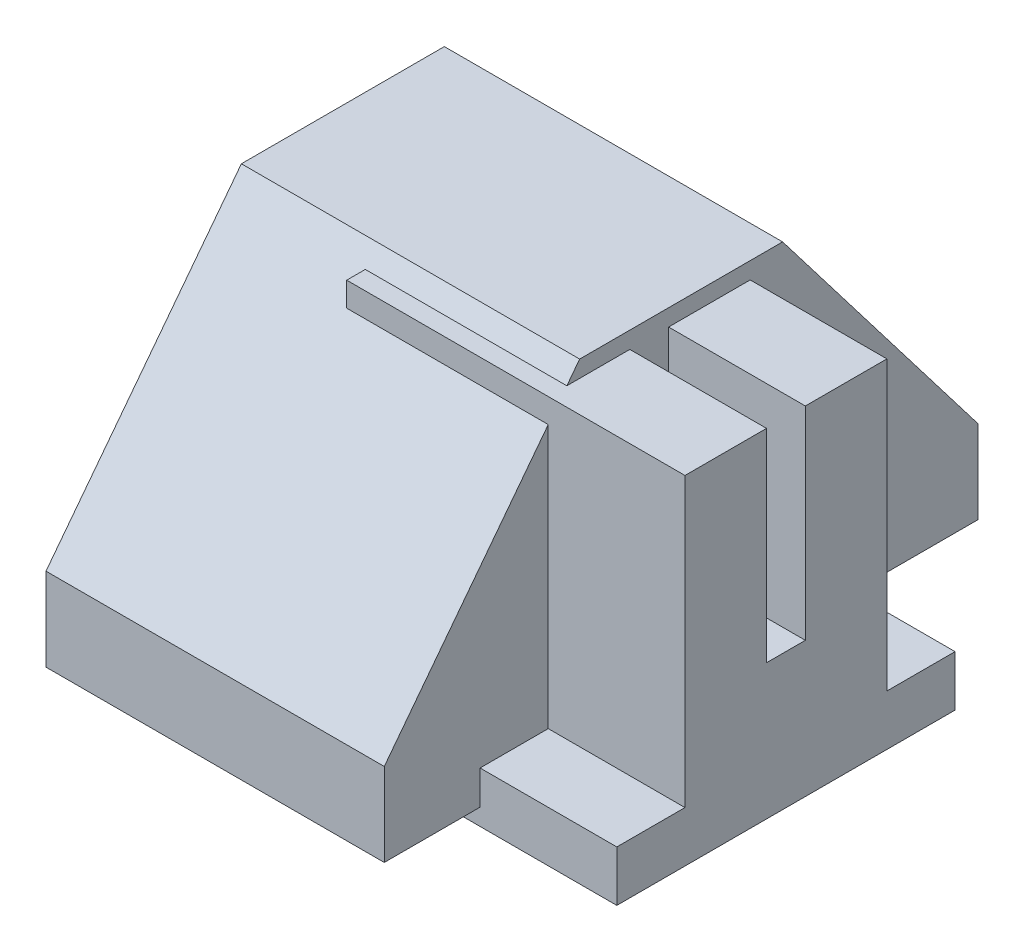
ISO-10303-21;
HEADER;
FILE_DESCRIPTION(('STEP AP214'),'2;1');
FILE_NAME('part.step','',(''),(''),'','','');
FILE_SCHEMA(('AUTOMOTIVE_DESIGN { 1 0 10303 214 1 1 1 1 }'));
ENDSEC;
DATA;
#1=APPLICATION_CONTEXT('core data for automotive mechanical design processes');
#2=APPLICATION_PROTOCOL_DEFINITION('international standard','automotive_design',2000,#1);
#3=PRODUCT_CONTEXT('',#1,'mechanical');
#4=PRODUCT('Part','Part','',(#3));
#5=PRODUCT_RELATED_PRODUCT_CATEGORY('part','',(#4));
#6=PRODUCT_DEFINITION_FORMATION('','',#4);
#7=PRODUCT_DEFINITION_CONTEXT('part definition',#1,'design');
#8=PRODUCT_DEFINITION('design','',#6,#7);
#9=PRODUCT_DEFINITION_SHAPE('','',#8);
#10=(LENGTH_UNIT() NAMED_UNIT(*) SI_UNIT(.MILLI.,.METRE.));
#11=(NAMED_UNIT(*) PLANE_ANGLE_UNIT() SI_UNIT($,.RADIAN.));
#12=(NAMED_UNIT(*) SI_UNIT($,.STERADIAN.) SOLID_ANGLE_UNIT());
#13=UNCERTAINTY_MEASURE_WITH_UNIT(LENGTH_MEASURE(1.E-05),#10,'distance_accuracy_value','');
#14=(GEOMETRIC_REPRESENTATION_CONTEXT(3) GLOBAL_UNCERTAINTY_ASSIGNED_CONTEXT((#13)) GLOBAL_UNIT_ASSIGNED_CONTEXT((#10,
#11,#12)) REPRESENTATION_CONTEXT('',''));
#15=CARTESIAN_POINT('',(0.,0.,0.));
#16=DIRECTION('',(0.,0.,1.));
#17=DIRECTION('',(1.,0.,0.));
#18=AXIS2_PLACEMENT_3D('',#15,#16,#17);
#19=CARTESIAN_POINT('',(-36.7744856282311,3.36962597201002,51.93957207844));
#20=DIRECTION('',(0.,0.,-1.));
#21=DIRECTION('',(-1.,0.,0.));
#22=AXIS2_PLACEMENT_3D('',#19,#20,#21);
#23=PLANE('',#22);
#24=DIRECTION('',(0.,-1.,0.));
#25=VECTOR('',#24,1.);
#26=CARTESIAN_POINT('',(-86.7744856282311,3.36962597201002,51.93957207844));
#27=LINE('',#26,#25);
#28=CARTESIAN_POINT('',(-86.7744856282311,3.36962597201002,51.93957207844));
#29=VERTEX_POINT('',#28);
#30=CARTESIAN_POINT('',(-86.7744856282311,-8.92020292663197,51.93957207844));
#31=VERTEX_POINT('',#30);
#32=EDGE_CURVE('E140',#29,#31,#27,.T.);
#33=ORIENTED_EDGE('',*,*,#32,.T.);
#34=DIRECTION('',(-1.,0.,0.));
#35=VECTOR('',#34,1.);
#36=CARTESIAN_POINT('',(-36.7744856282311,-8.92020292663197,51.93957207844));
#37=LINE('',#36,#35);
#38=CARTESIAN_POINT('',(-36.7744856282311,-8.92020292663197,51.93957207844));
#39=VERTEX_POINT('',#38);
#40=EDGE_CURVE('E12',#39,#31,#37,.T.);
#41=ORIENTED_EDGE('',*,*,#40,.F.);
#42=DIRECTION('',(0.,-1.,0.));
#43=VECTOR('',#42,1.);
#44=CARTESIAN_POINT('',(-36.7744856282311,3.36962597201002,51.93957207844));
#45=LINE('',#44,#43);
#46=CARTESIAN_POINT('',(-36.7744856282311,3.36962597201002,51.93957207844));
#47=VERTEX_POINT('',#46);
#48=EDGE_CURVE('E156',#47,#39,#45,.T.);
#49=ORIENTED_EDGE('',*,*,#48,.F.);
#50=DIRECTION('',(-1.,0.,0.));
#51=VECTOR('',#50,1.);
#52=CARTESIAN_POINT('',(-36.7744856282311,3.36962597201002,51.93957207844));
#53=LINE('',#52,#51);
#54=EDGE_CURVE('E136',#47,#29,#53,.T.);
#55=ORIENTED_EDGE('',*,*,#54,.T.);
#56=EDGE_LOOP('',(#33,#41,#49,#55));
#57=FACE_BOUND('',#56,.T.);
#58=ADVANCED_FACE('F51',(#57),#23,.F.);
#59=CARTESIAN_POINT('',(-36.7744856282311,-8.92020292663197,51.93957207844));
#60=DIRECTION('',(0.,1.,0.));
#61=DIRECTION('',(0.,0.,1.));
#62=AXIS2_PLACEMENT_3D('',#59,#60,#61);
#63=PLANE('',#62);
#64=DIRECTION('',(0.,0.,-1.));
#65=VECTOR('',#64,1.);
#66=CARTESIAN_POINT('',(-86.7744856282311,-8.92020292663197,51.93957207844));
#67=LINE('',#66,#65);
#68=CARTESIAN_POINT('',(-86.7744856282311,-8.92020292663197,-35.8190813322421));
#69=VERTEX_POINT('',#68);
#70=EDGE_CURVE('E144',#31,#69,#67,.T.);
#71=ORIENTED_EDGE('',*,*,#70,.T.);
#72=DIRECTION('',(-1.,0.,0.));
#73=VECTOR('',#72,1.);
#74=CARTESIAN_POINT('',(-36.7744856282311,-8.92020292663197,-35.8190813322421));
#75=LINE('',#74,#73);
#76=CARTESIAN_POINT('',(-36.7744856282311,-8.92020292663197,-35.8190813322421));
#77=VERTEX_POINT('',#76);
#78=EDGE_CURVE('E60',#77,#69,#75,.T.);
#79=ORIENTED_EDGE('',*,*,#78,.F.);
#80=DIRECTION('',(0.,0.,-1.));
#81=VECTOR('',#80,1.);
#82=CARTESIAN_POINT('',(-36.7744856282311,-8.92020292663197,51.93957207844));
#83=LINE('',#82,#81);
#84=EDGE_CURVE('E105',#39,#77,#83,.T.);
#85=ORIENTED_EDGE('',*,*,#84,.F.);
#86=ORIENTED_EDGE('',*,*,#40,.T.);
#87=EDGE_LOOP('',(#71,#79,#85,#86));
#88=FACE_BOUND('',#87,.T.);
#89=ADVANCED_FACE('F184',(#88),#63,.F.);
#90=CARTESIAN_POINT('',(-36.7744856282311,-8.92020292663197,-35.8190813322421));
#91=DIRECTION('',(0.,0.,1.));
#92=DIRECTION('',(1.,0.,0.));
#93=AXIS2_PLACEMENT_3D('',#90,#91,#92);
#94=PLANE('',#93);
#95=DIRECTION('',(0.,1.,0.));
#96=VECTOR('',#95,1.);
#97=CARTESIAN_POINT('',(-86.7744856282311,-8.92020292663197,-35.8190813322421));
#98=LINE('',#97,#96);
#99=CARTESIAN_POINT('',(-86.7744856282311,3.36962597201002,-35.8190813322421));
#100=VERTEX_POINT('',#99);
#101=EDGE_CURVE('E147',#69,#100,#98,.T.);
#102=ORIENTED_EDGE('',*,*,#101,.T.);
#103=DIRECTION('',(-1.,0.,0.));
#104=VECTOR('',#103,1.);
#105=CARTESIAN_POINT('',(-36.7744856282311,3.36962597201002,-35.8190813322421));
#106=LINE('',#105,#104);
#107=CARTESIAN_POINT('',(-36.7744856282311,3.36962597201002,-35.8190813322421));
#108=VERTEX_POINT('',#107);
#109=EDGE_CURVE('E129',#108,#100,#106,.T.);
#110=ORIENTED_EDGE('',*,*,#109,.F.);
#111=DIRECTION('',(0.,1.,0.));
#112=VECTOR('',#111,1.);
#113=CARTESIAN_POINT('',(-36.7744856282311,-8.92020292663197,-35.8190813322421));
#114=LINE('',#113,#112);
#115=EDGE_CURVE('E118',#77,#108,#114,.T.);
#116=ORIENTED_EDGE('',*,*,#115,.F.);
#117=ORIENTED_EDGE('',*,*,#78,.T.);
#118=EDGE_LOOP('',(#102,#110,#116,#117));
#119=FACE_BOUND('',#118,.T.);
#120=ADVANCED_FACE('F166',(#119),#94,.F.);
#121=CARTESIAN_POINT('',(-36.7744856282311,3.36962597201002,-35.8190813322421));
#122=DIRECTION('',(0.,-0.608009739937123,0.793929566234683));
#123=DIRECTION('',(0.,-0.793929566234683,-0.608009739937123));
#124=AXIS2_PLACEMENT_3D('',#121,#122,#123);
#125=PLANE('',#124);
#126=DIRECTION('',(0.,0.793929566234683,0.608009739937123));
#127=VECTOR('',#126,1.);
#128=CARTESIAN_POINT('',(-86.7744856282311,3.36962597201002,-35.8190813322421));
#129=LINE('',#128,#127);
#130=CARTESIAN_POINT('',(-86.7744856282311,41.079797073368,-6.93975462690105));
#131=VERTEX_POINT('',#130);
#132=EDGE_CURVE('E127',#100,#131,#129,.T.);
#133=ORIENTED_EDGE('',*,*,#132,.T.);
#134=DIRECTION('',(-1.,0.,0.));
#135=VECTOR('',#134,1.);
#136=CARTESIAN_POINT('',(-36.7744856282311,41.079797073368,-6.93975462690105));
#137=LINE('',#136,#135);
#138=CARTESIAN_POINT('',(-36.7744856282311,41.079797073368,-6.93975462690105));
#139=VERTEX_POINT('',#138);
#140=EDGE_CURVE('E124',#139,#131,#137,.T.);
#141=ORIENTED_EDGE('',*,*,#140,.F.);
#142=DIRECTION('',(0.,0.793929566234683,0.608009739937123));
#143=VECTOR('',#142,1.);
#144=CARTESIAN_POINT('',(-36.7744856282311,3.36962597201002,-35.8190813322421));
#145=LINE('',#144,#143);
#146=EDGE_CURVE('E112',#108,#139,#145,.T.);
#147=ORIENTED_EDGE('',*,*,#146,.F.);
#148=ORIENTED_EDGE('',*,*,#109,.T.);
#149=EDGE_LOOP('',(#133,#141,#147,#148));
#150=FACE_BOUND('',#149,.T.);
#151=ADVANCED_FACE('F125',(#150),#125,.F.);
#152=CARTESIAN_POINT('',(-36.7744856282311,41.079797073368,-6.93975462690105));
#153=DIRECTION('',(0.,-1.,0.));
#154=DIRECTION('',(0.,0.,-1.));
#155=AXIS2_PLACEMENT_3D('',#152,#153,#154);
#156=PLANE('',#155);
#157=DIRECTION('',(0.,0.,1.));
#158=VECTOR('',#157,1.);
#159=CARTESIAN_POINT('',(-86.7744856282311,41.079797073368,-6.93975462690105));
#160=LINE('',#159,#158);
#161=CARTESIAN_POINT('',(-86.7744856282311,41.079797073368,23.0602453730989));
#162=VERTEX_POINT('',#161);
#163=EDGE_CURVE('E91',#131,#162,#160,.T.);
#164=ORIENTED_EDGE('',*,*,#163,.T.);
#165=DIRECTION('',(-1.,0.,0.));
#166=VECTOR('',#165,1.);
#167=CARTESIAN_POINT('',(-36.7744856282311,41.079797073368,23.0602453730989));
#168=LINE('',#167,#166);
#169=CARTESIAN_POINT('',(-36.7744856282311,41.079797073368,23.0602453730989));
#170=VERTEX_POINT('',#169);
#171=EDGE_CURVE('E130',#170,#162,#168,.T.);
#172=ORIENTED_EDGE('',*,*,#171,.F.);
#173=DIRECTION('',(0.,0.,1.));
#174=VECTOR('',#173,1.);
#175=CARTESIAN_POINT('',(-36.7744856282311,41.079797073368,-6.93975462690105));
#176=LINE('',#175,#174);
#177=EDGE_CURVE('E116',#139,#170,#176,.T.);
#178=ORIENTED_EDGE('',*,*,#177,.F.);
#179=ORIENTED_EDGE('',*,*,#140,.T.);
#180=EDGE_LOOP('',(#164,#172,#178,#179));
#181=FACE_BOUND('',#180,.T.);
#182=ADVANCED_FACE('F132',(#181),#156,.F.);
#183=CARTESIAN_POINT('',(-36.7744856282311,41.079797073368,23.0602453730989));
#184=DIRECTION('',(0.,-0.608009739937124,-0.793929566234683));
#185=DIRECTION('',(0.,0.793929566234683,-0.608009739937124));
#186=AXIS2_PLACEMENT_3D('',#183,#184,#185);
#187=PLANE('',#186);
#188=DIRECTION('',(0.,-0.793929566234683,0.608009739937124));
#189=VECTOR('',#188,1.);
#190=CARTESIAN_POINT('',(-86.7744856282311,41.079797073368,23.0602453730989));
#191=LINE('',#190,#189);
#192=EDGE_CURVE('E97',#162,#29,#191,.T.);
#193=ORIENTED_EDGE('',*,*,#192,.T.);
#194=ORIENTED_EDGE('',*,*,#54,.F.);
#195=DIRECTION('',(0.,-0.793929566234683,0.608009739937124));
#196=VECTOR('',#195,1.);
#197=CARTESIAN_POINT('',(-36.7744856282311,41.079797073368,23.0602453730989));
#198=LINE('',#197,#196);
#199=EDGE_CURVE('E68',#170,#47,#198,.T.);
#200=ORIENTED_EDGE('',*,*,#199,.F.);
#201=ORIENTED_EDGE('',*,*,#171,.T.);
#202=EDGE_LOOP('',(#193,#194,#200,#201));
#203=FACE_BOUND('',#202,.T.);
#204=ADVANCED_FACE('F173',(#203),#187,.F.);
#205=CARTESIAN_POINT('',(-36.7744856282311,-8.92020292663197,51.93957207844));
#206=DIRECTION('',(1.,0.,0.));
#207=DIRECTION('',(0.,0.,-1.));
#208=AXIS2_PLACEMENT_3D('',#205,#206,#207);
#209=PLANE('',#208);
#210=ORIENTED_EDGE('',*,*,#48,.T.);
#211=ORIENTED_EDGE('',*,*,#84,.T.);
#212=ORIENTED_EDGE('',*,*,#115,.T.);
#213=ORIENTED_EDGE('',*,*,#146,.T.);
#214=ORIENTED_EDGE('',*,*,#177,.T.);
#215=ORIENTED_EDGE('',*,*,#199,.T.);
#216=EDGE_LOOP('',(#210,#211,#212,#213,#214,#215));
#217=FACE_BOUND('',#216,.T.);
#218=ADVANCED_FACE('F114',(#217),#209,.T.);
#219=CARTESIAN_POINT('',(-86.7744856282311,-8.92020292663197,51.93957207844));
#220=DIRECTION('',(1.,0.,0.));
#221=DIRECTION('',(0.,0.,-1.));
#222=AXIS2_PLACEMENT_3D('',#219,#220,#221);
#223=PLANE('',#222);
#224=ORIENTED_EDGE('',*,*,#32,.F.);
#225=ORIENTED_EDGE('',*,*,#192,.F.);
#226=ORIENTED_EDGE('',*,*,#163,.F.);
#227=ORIENTED_EDGE('',*,*,#132,.F.);
#228=ORIENTED_EDGE('',*,*,#101,.F.);
#229=ORIENTED_EDGE('',*,*,#70,.F.);
#230=EDGE_LOOP('',(#224,#225,#226,#227,#228,#229));
#231=FACE_BOUND('',#230,.T.);
#232=ADVANCED_FACE('F169',(#231),#223,.F.);
#233=CLOSED_SHELL('',(#58,#89,#120,#151,#182,#204,#218,#232));
#234=MANIFOLD_SOLID_BREP('B2',#233);
#235=CARTESIAN_POINT('',(-16.5649722388904,-3.905538089092,27.7024712103546));
#236=DIRECTION('',(0.,-1.,0.));
#237=DIRECTION('',(0.,0.,-1.));
#238=AXIS2_PLACEMENT_3D('',#235,#236,#237);
#239=PLANE('',#238);
#240=DIRECTION('',(0.,0.,1.));
#241=VECTOR('',#240,1.);
#242=CARTESIAN_POINT('',(-66.5649722388904,-3.905538089092,27.7024712103546));
#243=LINE('',#242,#241);
#244=CARTESIAN_POINT('',(-66.5649722388904,-3.905538089092,27.7024712103546));
#245=VERTEX_POINT('',#244);
#246=CARTESIAN_POINT('',(-66.5649722388904,-3.905538089092,37.7787935627372));
#247=VERTEX_POINT('',#246);
#248=EDGE_CURVE('E365',#245,#247,#243,.T.);
#249=ORIENTED_EDGE('',*,*,#248,.T.);
#250=DIRECTION('',(-1.,0.,0.));
#251=VECTOR('',#250,1.);
#252=CARTESIAN_POINT('',(-16.5649722388904,-3.905538089092,37.7787935627372));
#253=LINE('',#252,#251);
#254=CARTESIAN_POINT('',(-16.5649722388904,-3.905538089092,37.7787935627372));
#255=VERTEX_POINT('',#254);
#256=EDGE_CURVE('E49',#255,#247,#253,.T.);
#257=ORIENTED_EDGE('',*,*,#256,.F.);
#258=DIRECTION('',(0.,0.,1.));
#259=VECTOR('',#258,1.);
#260=CARTESIAN_POINT('',(-16.5649722388904,-3.905538089092,27.7024712103546));
#261=LINE('',#260,#259);
#262=CARTESIAN_POINT('',(-16.5649722388904,-3.905538089092,27.7024712103546));
#263=VERTEX_POINT('',#262);
#264=EDGE_CURVE('E387',#263,#255,#261,.T.);
#265=ORIENTED_EDGE('',*,*,#264,.F.);
#266=DIRECTION('',(-1.,0.,0.));
#267=VECTOR('',#266,1.);
#268=CARTESIAN_POINT('',(-16.5649722388904,-3.905538089092,27.7024712103546));
#269=LINE('',#268,#267);
#270=EDGE_CURVE('E361',#263,#245,#269,.T.);
#271=ORIENTED_EDGE('',*,*,#270,.T.);
#272=EDGE_LOOP('',(#249,#257,#265,#271));
#273=FACE_BOUND('',#272,.T.);
#274=ADVANCED_FACE('F245',(#273),#239,.F.);
#275=CARTESIAN_POINT('',(-16.5649722388904,-3.905538089092,37.7787935627372));
#276=DIRECTION('',(0.,0.,-1.));
#277=DIRECTION('',(-1.,0.,0.));
#278=AXIS2_PLACEMENT_3D('',#275,#276,#277);
#279=PLANE('',#278);
#280=DIRECTION('',(0.,-1.,0.));
#281=VECTOR('',#280,1.);
#282=CARTESIAN_POINT('',(-66.5649722388904,-3.905538089092,37.7787935627372));
#283=LINE('',#282,#281);
#284=CARTESIAN_POINT('',(-66.5649722388904,-11.3934632551037,37.7787935627372));
#285=VERTEX_POINT('',#284);
#286=EDGE_CURVE('E368',#247,#285,#283,.T.);
#287=ORIENTED_EDGE('',*,*,#286,.T.);
#288=DIRECTION('',(-1.,0.,0.));
#289=VECTOR('',#288,1.);
#290=CARTESIAN_POINT('',(-16.5649722388904,-11.3934632551037,37.7787935627372));
#291=LINE('',#290,#289);
#292=CARTESIAN_POINT('',(-16.5649722388904,-11.3934632551037,37.7787935627372));
#293=VERTEX_POINT('',#292);
#294=EDGE_CURVE('E253',#293,#285,#291,.T.);
#295=ORIENTED_EDGE('',*,*,#294,.F.);
#296=DIRECTION('',(0.,-1.,0.));
#297=VECTOR('',#296,1.);
#298=CARTESIAN_POINT('',(-16.5649722388904,-3.905538089092,37.7787935627372));
#299=LINE('',#298,#297);
#300=EDGE_CURVE('E316',#255,#293,#299,.T.);
#301=ORIENTED_EDGE('',*,*,#300,.F.);
#302=ORIENTED_EDGE('',*,*,#256,.T.);
#303=EDGE_LOOP('',(#287,#295,#301,#302));
#304=FACE_BOUND('',#303,.T.);
#305=ADVANCED_FACE('F465',(#304),#279,.F.);
#306=CARTESIAN_POINT('',(-16.5649722388904,-11.3934632551037,37.7787935627372));
#307=DIRECTION('',(0.,1.,0.));
#308=DIRECTION('',(0.,0.,1.));
#309=AXIS2_PLACEMENT_3D('',#306,#307,#308);
#310=PLANE('',#309);
#311=DIRECTION('',(0.,0.,-1.));
#312=VECTOR('',#311,1.);
#313=CARTESIAN_POINT('',(-66.5649722388904,-11.3934632551037,37.7787935627372));
#314=LINE('',#313,#312);
#315=CARTESIAN_POINT('',(-66.5649722388904,-11.3934632551037,-12.2212064372628));
#316=VERTEX_POINT('',#315);
#317=EDGE_CURVE('E370',#285,#316,#314,.T.);
#318=ORIENTED_EDGE('',*,*,#317,.T.);
#319=DIRECTION('',(-1.,0.,0.));
#320=VECTOR('',#319,1.);
#321=CARTESIAN_POINT('',(-16.5649722388904,-11.3934632551037,-12.2212064372628));
#322=LINE('',#321,#320);
#323=CARTESIAN_POINT('',(-16.5649722388904,-11.3934632551037,-12.2212064372628));
#324=VERTEX_POINT('',#323);
#325=EDGE_CURVE('E406',#324,#316,#322,.T.);
#326=ORIENTED_EDGE('',*,*,#325,.F.);
#327=DIRECTION('',(0.,0.,-1.));
#328=VECTOR('',#327,1.);
#329=CARTESIAN_POINT('',(-16.5649722388904,-11.3934632551037,37.7787935627372));
#330=LINE('',#329,#328);
#331=EDGE_CURVE('E414',#293,#324,#330,.T.);
#332=ORIENTED_EDGE('',*,*,#331,.F.);
#333=ORIENTED_EDGE('',*,*,#294,.T.);
#334=EDGE_LOOP('',(#318,#326,#332,#333));
#335=FACE_BOUND('',#334,.T.);
#336=ADVANCED_FACE('F412',(#335),#310,.F.);
#337=CARTESIAN_POINT('',(-16.5649722388904,-11.3934632551037,-12.2212064372628));
#338=DIRECTION('',(0.,0.,1.));
#339=DIRECTION('',(1.,0.,0.));
#340=AXIS2_PLACEMENT_3D('',#337,#338,#339);
#341=PLANE('',#340);
#342=DIRECTION('',(0.,1.,0.));
#343=VECTOR('',#342,1.);
#344=CARTESIAN_POINT('',(-66.5649722388904,-11.3934632551037,-12.2212064372628));
#345=LINE('',#344,#343);
#346=CARTESIAN_POINT('',(-66.5649722388904,-3.905538089092,-12.2212064372628));
#347=VERTEX_POINT('',#346);
#348=EDGE_CURVE('E372',#316,#347,#345,.T.);
#349=ORIENTED_EDGE('',*,*,#348,.T.);
#350=DIRECTION('',(-1.,0.,0.));
#351=VECTOR('',#350,1.);
#352=CARTESIAN_POINT('',(-16.5649722388904,-3.905538089092,-12.2212064372628));
#353=LINE('',#352,#351);
#354=CARTESIAN_POINT('',(-16.5649722388904,-3.905538089092,-12.2212064372628));
#355=VERTEX_POINT('',#354);
#356=EDGE_CURVE('E403',#355,#347,#353,.T.);
#357=ORIENTED_EDGE('',*,*,#356,.F.);
#358=DIRECTION('',(0.,1.,0.));
#359=VECTOR('',#358,1.);
#360=CARTESIAN_POINT('',(-16.5649722388904,-11.3934632551037,-12.2212064372628));
#361=LINE('',#360,#359);
#362=EDGE_CURVE('E432',#324,#355,#361,.T.);
#363=ORIENTED_EDGE('',*,*,#362,.F.);
#364=ORIENTED_EDGE('',*,*,#325,.T.);
#365=EDGE_LOOP('',(#349,#357,#363,#364));
#366=FACE_BOUND('',#365,.T.);
#367=ADVANCED_FACE('F423',(#366),#341,.F.);
#368=CARTESIAN_POINT('',(-16.5649722388904,-3.905538089092,-12.2212064372628));
#369=DIRECTION('',(0.,-1.,0.));
#370=DIRECTION('',(0.,0.,-1.));
#371=AXIS2_PLACEMENT_3D('',#368,#369,#370);
#372=PLANE('',#371);
#373=DIRECTION('',(0.,0.,1.));
#374=VECTOR('',#373,1.);
#375=CARTESIAN_POINT('',(-66.5649722388904,-3.905538089092,-12.2212064372628));
#376=LINE('',#375,#374);
#377=CARTESIAN_POINT('',(-66.5649722388904,-3.905538089092,-2.14488408488021));
#378=VERTEX_POINT('',#377);
#379=EDGE_CURVE('E374',#347,#378,#376,.T.);
#380=ORIENTED_EDGE('',*,*,#379,.T.);
#381=DIRECTION('',(-1.,0.,0.));
#382=VECTOR('',#381,1.);
#383=CARTESIAN_POINT('',(-16.5649722388904,-3.905538089092,-2.14488408488021));
#384=LINE('',#383,#382);
#385=CARTESIAN_POINT('',(-16.5649722388904,-3.905538089092,-2.14488408488021));
#386=VERTEX_POINT('',#385);
#387=EDGE_CURVE('E400',#386,#378,#384,.T.);
#388=ORIENTED_EDGE('',*,*,#387,.F.);
#389=DIRECTION('',(0.,0.,1.));
#390=VECTOR('',#389,1.);
#391=CARTESIAN_POINT('',(-16.5649722388904,-3.905538089092,-12.2212064372628));
#392=LINE('',#391,#390);
#393=EDGE_CURVE('E429',#355,#386,#392,.T.);
#394=ORIENTED_EDGE('',*,*,#393,.F.);
#395=ORIENTED_EDGE('',*,*,#356,.T.);
#396=EDGE_LOOP('',(#380,#388,#394,#395));
#397=FACE_BOUND('',#396,.T.);
#398=ADVANCED_FACE('F427',(#397),#372,.F.);
#399=CARTESIAN_POINT('',(-16.5649722388904,-3.905538089092,-2.14488408488021));
#400=DIRECTION('',(0.,0.,1.));
#401=DIRECTION('',(1.,0.,0.));
#402=AXIS2_PLACEMENT_3D('',#399,#400,#401);
#403=PLANE('',#402);
#404=DIRECTION('',(0.,1.,0.));
#405=VECTOR('',#404,1.);
#406=CARTESIAN_POINT('',(-66.5649722388904,-3.905538089092,-2.14488408488021));
#407=LINE('',#406,#405);
#408=CARTESIAN_POINT('',(-66.5649722388904,38.6065367448964,-2.14488408488021));
#409=VERTEX_POINT('',#408);
#410=EDGE_CURVE('E376',#378,#409,#407,.T.);
#411=ORIENTED_EDGE('',*,*,#410,.T.);
#412=DIRECTION('',(-1.,0.,0.));
#413=VECTOR('',#412,1.);
#414=CARTESIAN_POINT('',(-16.5649722388904,38.6065367448964,-2.14488408488021));
#415=LINE('',#414,#413);
#416=CARTESIAN_POINT('',(-16.5649722388904,38.6065367448964,-2.14488408488021));
#417=VERTEX_POINT('',#416);
#418=EDGE_CURVE('E397',#417,#409,#415,.T.);
#419=ORIENTED_EDGE('',*,*,#418,.F.);
#420=DIRECTION('',(0.,1.,0.));
#421=VECTOR('',#420,1.);
#422=CARTESIAN_POINT('',(-16.5649722388904,-3.905538089092,-2.14488408488021));
#423=LINE('',#422,#421);
#424=EDGE_CURVE('E431',#386,#417,#423,.T.);
#425=ORIENTED_EDGE('',*,*,#424,.F.);
#426=ORIENTED_EDGE('',*,*,#387,.T.);
#427=EDGE_LOOP('',(#411,#419,#425,#426));
#428=FACE_BOUND('',#427,.T.);
#429=ADVANCED_FACE('F478',(#428),#403,.F.);
#430=CARTESIAN_POINT('',(-16.5649722388904,38.6065367448964,-2.14488408488021));
#431=DIRECTION('',(0.,-1.,0.));
#432=DIRECTION('',(0.,0.,-1.));
#433=AXIS2_PLACEMENT_3D('',#430,#431,#432);
#434=PLANE('',#433);
#435=DIRECTION('',(0.,0.,1.));
#436=VECTOR('',#435,1.);
#437=CARTESIAN_POINT('',(-66.5649722388904,38.6065367448964,-2.14488408488021));
#438=LINE('',#437,#436);
#439=CARTESIAN_POINT('',(-66.5649722388904,38.6065367448964,9.91044619744044));
#440=VERTEX_POINT('',#439);
#441=EDGE_CURVE('E378',#409,#440,#438,.T.);
#442=ORIENTED_EDGE('',*,*,#441,.T.);
#443=DIRECTION('',(-1.,0.,0.));
#444=VECTOR('',#443,1.);
#445=CARTESIAN_POINT('',(-16.5649722388904,38.6065367448964,9.91044619744044));
#446=LINE('',#445,#444);
#447=CARTESIAN_POINT('',(-16.5649722388904,38.6065367448964,9.91044619744044));
#448=VERTEX_POINT('',#447);
#449=EDGE_CURVE('E394',#448,#440,#446,.T.);
#450=ORIENTED_EDGE('',*,*,#449,.F.);
#451=DIRECTION('',(0.,0.,1.));
#452=VECTOR('',#451,1.);
#453=CARTESIAN_POINT('',(-16.5649722388904,38.6065367448964,-2.14488408488021));
#454=LINE('',#453,#452);
#455=EDGE_CURVE('E434',#417,#448,#454,.T.);
#456=ORIENTED_EDGE('',*,*,#455,.F.);
#457=ORIENTED_EDGE('',*,*,#418,.T.);
#458=EDGE_LOOP('',(#442,#450,#456,#457));
#459=FACE_BOUND('',#458,.T.);
#460=ADVANCED_FACE('F481',(#459),#434,.F.);
#461=CARTESIAN_POINT('',(-16.5649722388904,38.6065367448964,9.91044619744044));
#462=DIRECTION('',(0.,0.,-1.));
#463=DIRECTION('',(-1.,0.,0.));
#464=AXIS2_PLACEMENT_3D('',#461,#462,#463);
#465=PLANE('',#464);
#466=DIRECTION('',(0.,-1.,0.));
#467=VECTOR('',#466,1.);
#468=CARTESIAN_POINT('',(-66.5649722388904,38.6065367448964,9.91044619744044));
#469=LINE('',#468,#467);
#470=CARTESIAN_POINT('',(-66.5649722388904,8.60653674489634,9.91044619744044));
#471=VERTEX_POINT('',#470);
#472=EDGE_CURVE('E380',#440,#471,#469,.T.);
#473=ORIENTED_EDGE('',*,*,#472,.T.);
#474=DIRECTION('',(-1.,0.,0.));
#475=VECTOR('',#474,1.);
#476=CARTESIAN_POINT('',(-16.5649722388904,8.60653674489634,9.91044619744044));
#477=LINE('',#476,#475);
#478=CARTESIAN_POINT('',(-16.5649722388904,8.60653674489634,9.91044619744044));
#479=VERTEX_POINT('',#478);
#480=EDGE_CURVE('E391',#479,#471,#477,.T.);
#481=ORIENTED_EDGE('',*,*,#480,.F.);
#482=DIRECTION('',(0.,-1.,0.));
#483=VECTOR('',#482,1.);
#484=CARTESIAN_POINT('',(-16.5649722388904,38.6065367448964,9.91044619744044));
#485=LINE('',#484,#483);
#486=EDGE_CURVE('E440',#448,#479,#485,.T.);
#487=ORIENTED_EDGE('',*,*,#486,.F.);
#488=ORIENTED_EDGE('',*,*,#449,.T.);
#489=EDGE_LOOP('',(#473,#481,#487,#488));
#490=FACE_BOUND('',#489,.T.);
#491=ADVANCED_FACE('F446',(#490),#465,.F.);
#492=CARTESIAN_POINT('',(-16.5649722388904,8.60653674489634,9.91044619744044));
#493=DIRECTION('',(0.,-1.,0.));
#494=DIRECTION('',(0.,0.,-1.));
#495=AXIS2_PLACEMENT_3D('',#492,#493,#494);
#496=PLANE('',#495);
#497=DIRECTION('',(0.,0.,1.));
#498=VECTOR('',#497,1.);
#499=CARTESIAN_POINT('',(-66.5649722388904,8.60653674489634,9.91044619744044));
#500=LINE('',#499,#498);
#501=CARTESIAN_POINT('',(-66.5649722388904,8.60653674489634,15.647140928034));
#502=VERTEX_POINT('',#501);
#503=EDGE_CURVE('E382',#471,#502,#500,.T.);
#504=ORIENTED_EDGE('',*,*,#503,.T.);
#505=DIRECTION('',(-1.,0.,0.));
#506=VECTOR('',#505,1.);
#507=CARTESIAN_POINT('',(-16.5649722388904,8.60653674489634,15.647140928034));
#508=LINE('',#507,#506);
#509=CARTESIAN_POINT('',(-16.5649722388904,8.60653674489634,15.647140928034));
#510=VERTEX_POINT('',#509);
#511=EDGE_CURVE('E356',#510,#502,#508,.T.);
#512=ORIENTED_EDGE('',*,*,#511,.F.);
#513=DIRECTION('',(0.,0.,1.));
#514=VECTOR('',#513,1.);
#515=CARTESIAN_POINT('',(-16.5649722388904,8.60653674489634,9.91044619744044));
#516=LINE('',#515,#514);
#517=EDGE_CURVE('E347',#479,#510,#516,.T.);
#518=ORIENTED_EDGE('',*,*,#517,.F.);
#519=ORIENTED_EDGE('',*,*,#480,.T.);
#520=EDGE_LOOP('',(#504,#512,#518,#519));
#521=FACE_BOUND('',#520,.T.);
#522=ADVANCED_FACE('F450',(#521),#496,.F.);
#523=CARTESIAN_POINT('',(-16.5649722388904,8.60653674489634,15.647140928034));
#524=DIRECTION('',(0.,0.,1.));
#525=DIRECTION('',(1.,0.,0.));
#526=AXIS2_PLACEMENT_3D('',#523,#524,#525);
#527=PLANE('',#526);
#528=DIRECTION('',(0.,1.,0.));
#529=VECTOR('',#528,1.);
#530=CARTESIAN_POINT('',(-66.5649722388904,8.60653674489634,15.647140928034));
#531=LINE('',#530,#529);
#532=CARTESIAN_POINT('',(-66.5649722388904,38.6065367448963,15.647140928034));
#533=VERTEX_POINT('',#532);
#534=EDGE_CURVE('E355',#502,#533,#531,.T.);
#535=ORIENTED_EDGE('',*,*,#534,.T.);
#536=DIRECTION('',(-1.,0.,0.));
#537=VECTOR('',#536,1.);
#538=CARTESIAN_POINT('',(-16.5649722388904,38.6065367448963,15.647140928034));
#539=LINE('',#538,#537);
#540=CARTESIAN_POINT('',(-16.5649722388904,38.6065367448963,15.647140928034));
#541=VERTEX_POINT('',#540);
#542=EDGE_CURVE('E352',#541,#533,#539,.T.);
#543=ORIENTED_EDGE('',*,*,#542,.F.);
#544=DIRECTION('',(0.,1.,0.));
#545=VECTOR('',#544,1.);
#546=CARTESIAN_POINT('',(-16.5649722388904,8.60653674489634,15.647140928034));
#547=LINE('',#546,#545);
#548=EDGE_CURVE('E341',#510,#541,#547,.T.);
#549=ORIENTED_EDGE('',*,*,#548,.F.);
#550=ORIENTED_EDGE('',*,*,#511,.T.);
#551=EDGE_LOOP('',(#535,#543,#549,#550));
#552=FACE_BOUND('',#551,.T.);
#553=ADVANCED_FACE('F353',(#552),#527,.F.);
#554=CARTESIAN_POINT('',(-16.5649722388904,38.6065367448963,15.647140928034));
#555=DIRECTION('',(0.,-1.,0.));
#556=DIRECTION('',(0.,0.,-1.));
#557=AXIS2_PLACEMENT_3D('',#554,#555,#556);
#558=PLANE('',#557);
#559=DIRECTION('',(0.,0.,1.));
#560=VECTOR('',#559,1.);
#561=CARTESIAN_POINT('',(-66.5649722388904,38.6065367448963,15.647140928034));
#562=LINE('',#561,#560);
#563=CARTESIAN_POINT('',(-66.5649722388904,38.6065367448963,27.7024712103547));
#564=VERTEX_POINT('',#563);
#565=EDGE_CURVE('E302',#533,#564,#562,.T.);
#566=ORIENTED_EDGE('',*,*,#565,.T.);
#567=DIRECTION('',(-1.,0.,0.));
#568=VECTOR('',#567,1.);
#569=CARTESIAN_POINT('',(-16.5649722388904,38.6065367448963,27.7024712103547));
#570=LINE('',#569,#568);
#571=CARTESIAN_POINT('',(-16.5649722388904,38.6065367448963,27.7024712103547));
#572=VERTEX_POINT('',#571);
#573=EDGE_CURVE('E357',#572,#564,#570,.T.);
#574=ORIENTED_EDGE('',*,*,#573,.F.);
#575=DIRECTION('',(0.,0.,1.));
#576=VECTOR('',#575,1.);
#577=CARTESIAN_POINT('',(-16.5649722388904,38.6065367448963,15.647140928034));
#578=LINE('',#577,#576);
#579=EDGE_CURVE('E345',#541,#572,#578,.T.);
#580=ORIENTED_EDGE('',*,*,#579,.F.);
#581=ORIENTED_EDGE('',*,*,#542,.T.);
#582=EDGE_LOOP('',(#566,#574,#580,#581));
#583=FACE_BOUND('',#582,.T.);
#584=ADVANCED_FACE('F359',(#583),#558,.F.);
#585=CARTESIAN_POINT('',(-16.5649722388904,38.6065367448963,27.7024712103547));
#586=DIRECTION('',(0.,0.,-1.));
#587=DIRECTION('',(0.,1.,0.));
#588=AXIS2_PLACEMENT_3D('',#585,#586,#587);
#589=PLANE('',#588);
#590=DIRECTION('',(0.,-1.,0.));
#591=VECTOR('',#590,1.);
#592=CARTESIAN_POINT('',(-66.5649722388904,38.6065367448963,27.7024712103547));
#593=LINE('',#592,#591);
#594=EDGE_CURVE('E308',#564,#245,#593,.T.);
#595=ORIENTED_EDGE('',*,*,#594,.T.);
#596=ORIENTED_EDGE('',*,*,#270,.F.);
#597=DIRECTION('',(0.,-1.,0.));
#598=VECTOR('',#597,1.);
#599=CARTESIAN_POINT('',(-16.5649722388904,38.6065367448963,27.7024712103547));
#600=LINE('',#599,#598);
#601=EDGE_CURVE('E261',#572,#263,#600,.T.);
#602=ORIENTED_EDGE('',*,*,#601,.F.);
#603=ORIENTED_EDGE('',*,*,#573,.T.);
#604=EDGE_LOOP('',(#595,#596,#602,#603));
#605=FACE_BOUND('',#604,.T.);
#606=ADVANCED_FACE('F454',(#605),#589,.F.);
#607=CARTESIAN_POINT('',(-16.5649722388904,-3.905538089092,37.7787935627372));
#608=DIRECTION('',(1.,0.,0.));
#609=DIRECTION('',(0.,0.,-1.));
#610=AXIS2_PLACEMENT_3D('',#607,#608,#609);
#611=PLANE('',#610);
#612=ORIENTED_EDGE('',*,*,#264,.T.);
#613=ORIENTED_EDGE('',*,*,#300,.T.);
#614=ORIENTED_EDGE('',*,*,#331,.T.);
#615=ORIENTED_EDGE('',*,*,#362,.T.);
#616=ORIENTED_EDGE('',*,*,#393,.T.);
#617=ORIENTED_EDGE('',*,*,#424,.T.);
#618=ORIENTED_EDGE('',*,*,#455,.T.);
#619=ORIENTED_EDGE('',*,*,#486,.T.);
#620=ORIENTED_EDGE('',*,*,#517,.T.);
#621=ORIENTED_EDGE('',*,*,#548,.T.);
#622=ORIENTED_EDGE('',*,*,#579,.T.);
#623=ORIENTED_EDGE('',*,*,#601,.T.);
#624=EDGE_LOOP('',(#612,#613,#614,#615,#616,#617,#618,#619,#620,#621,#622,#623));
#625=FACE_BOUND('',#624,.T.);
#626=ADVANCED_FACE('F343',(#625),#611,.T.);
#627=CARTESIAN_POINT('',(-66.5649722388904,-3.905538089092,37.7787935627372));
#628=DIRECTION('',(1.,0.,0.));
#629=DIRECTION('',(0.,0.,-1.));
#630=AXIS2_PLACEMENT_3D('',#627,#628,#629);
#631=PLANE('',#630);
#632=ORIENTED_EDGE('',*,*,#248,.F.);
#633=ORIENTED_EDGE('',*,*,#594,.F.);
#634=ORIENTED_EDGE('',*,*,#565,.F.);
#635=ORIENTED_EDGE('',*,*,#534,.F.);
#636=ORIENTED_EDGE('',*,*,#503,.F.);
#637=ORIENTED_EDGE('',*,*,#472,.F.);
#638=ORIENTED_EDGE('',*,*,#441,.F.);
#639=ORIENTED_EDGE('',*,*,#410,.F.);
#640=ORIENTED_EDGE('',*,*,#379,.F.);
#641=ORIENTED_EDGE('',*,*,#348,.F.);
#642=ORIENTED_EDGE('',*,*,#317,.F.);
#643=ORIENTED_EDGE('',*,*,#286,.F.);
#644=EDGE_LOOP('',(#632,#633,#634,#635,#636,#637,#638,#639,#640,#641,#642,#643));
#645=FACE_BOUND('',#644,.T.);
#646=ADVANCED_FACE('F418',(#645),#631,.F.);
#647=CLOSED_SHELL('',(#274,#305,#336,#367,#398,#429,#460,#491,#522,#553,#584,#606,#626,#646));
#648=MANIFOLD_SOLID_BREP('B6',#647);
#649=ADVANCED_BREP_SHAPE_REPRESENTATION('',(#18,#234,#648),#14);
#650=SHAPE_DEFINITION_REPRESENTATION(#9,#649);
ENDSEC;
END-ISO-10303-21;
